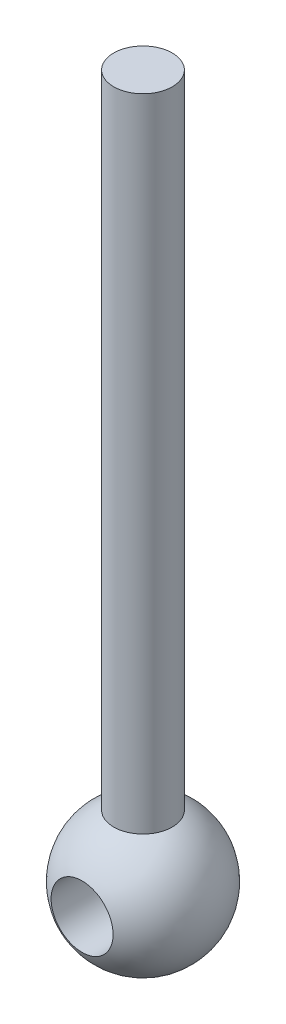
ISO-10303-21;
HEADER;
FILE_DESCRIPTION(('STEP AP214'),'2;1');
FILE_NAME('part.step','',(''),(''),'','','');
FILE_SCHEMA(('AUTOMOTIVE_DESIGN { 1 0 10303 214 1 1 1 1 }'));
ENDSEC;
DATA;
#1=APPLICATION_CONTEXT('core data for automotive mechanical design processes');
#2=APPLICATION_PROTOCOL_DEFINITION('international standard','automotive_design',2000,#1);
#3=PRODUCT_CONTEXT('',#1,'mechanical');
#4=PRODUCT('Part','Part','',(#3));
#5=PRODUCT_RELATED_PRODUCT_CATEGORY('part','',(#4));
#6=PRODUCT_DEFINITION_FORMATION('','',#4);
#7=PRODUCT_DEFINITION_CONTEXT('part definition',#1,'design');
#8=PRODUCT_DEFINITION('design','',#6,#7);
#9=PRODUCT_DEFINITION_SHAPE('','',#8);
#10=(LENGTH_UNIT() NAMED_UNIT(*) SI_UNIT(.MILLI.,.METRE.));
#11=(NAMED_UNIT(*) PLANE_ANGLE_UNIT() SI_UNIT($,.RADIAN.));
#12=(NAMED_UNIT(*) SI_UNIT($,.STERADIAN.) SOLID_ANGLE_UNIT());
#13=UNCERTAINTY_MEASURE_WITH_UNIT(LENGTH_MEASURE(1.E-05),#10,'distance_accuracy_value','');
#14=(GEOMETRIC_REPRESENTATION_CONTEXT(3) GLOBAL_UNCERTAINTY_ASSIGNED_CONTEXT((#13)) GLOBAL_UNIT_ASSIGNED_CONTEXT((#10,
#11,#12)) REPRESENTATION_CONTEXT('',''));
#15=CARTESIAN_POINT('',(0.,0.,0.));
#16=DIRECTION('',(0.,0.,1.));
#17=DIRECTION('',(1.,0.,0.));
#18=AXIS2_PLACEMENT_3D('',#15,#16,#17);
#19=CARTESIAN_POINT('',(0.,0.,0.));
#20=DIRECTION('',(0.,0.,1.));
#21=DIRECTION('',(0.999999999985917,5.30717958668678E-06,0.));
#22=AXIS2_PLACEMENT_3D('',#19,#20,#21);
#23=SPHERICAL_SURFACE('',#22,7.);
#24=CARTESIAN_POINT('',(0.,0.,-6.2385394925415));
#25=DIRECTION('',(0.,0.,1.));
#26=DIRECTION('',(1.,0.,0.));
#27=AXIS2_PLACEMENT_3D('',#24,#25,#26);
#28=CIRCLE('',#27,3.175);
#29=CARTESIAN_POINT('',(3.17499999995529,1.68502951877305E-05,-6.2385394925415));
#30=VERTEX_POINT('',#29);
#31=CARTESIAN_POINT('',(3.175,0.,-6.2385394925415));
#32=VERTEX_POINT('',#31);
#33=EDGE_CURVE('E11',#30,#32,#28,.T.);
#34=ORIENTED_EDGE('',*,*,#33,.T.);
#35=CARTESIAN_POINT('',(0.,0.,0.));
#36=DIRECTION('',(0.,1.,0.));
#37=DIRECTION('',(0.,0.,1.));
#38=AXIS2_PLACEMENT_3D('',#35,#36,#37);
#39=CIRCLE('',#38,7.);
#40=CARTESIAN_POINT('',(3.175,0.,6.2385394925415));
#41=VERTEX_POINT('',#40);
#42=EDGE_CURVE('E69',#41,#32,#39,.T.);
#43=ORIENTED_EDGE('',*,*,#42,.F.);
#44=CARTESIAN_POINT('',(0.,0.,6.2385394925415));
#45=DIRECTION('',(0.,0.,1.));
#46=DIRECTION('',(1.,0.,0.));
#47=AXIS2_PLACEMENT_3D('',#44,#45,#46);
#48=CIRCLE('',#47,3.175);
#49=CARTESIAN_POINT('',(3.17499999995529,1.68502951877305E-05,6.2385394925415));
#50=VERTEX_POINT('',#49);
#51=EDGE_CURVE('E55',#50,#41,#48,.T.);
#52=ORIENTED_EDGE('',*,*,#51,.F.);
#53=CARTESIAN_POINT('',(0.,0.,0.));
#54=DIRECTION('',(-5.30717958668678E-06,0.999999999985917,0.));
#55=DIRECTION('',(0.,0.,1.));
#56=AXIS2_PLACEMENT_3D('',#53,#54,#55);
#57=CIRCLE('',#56,7.);
#58=EDGE_CURVE('E75',#50,#30,#57,.T.);
#59=ORIENTED_EDGE('',*,*,#58,.T.);
#60=EDGE_LOOP('',(#34,#43,#52,#59));
#61=FACE_BOUND('',#60,.T.);
#62=CARTESIAN_POINT('',(0.,6.32455532033676,0.));
#63=DIRECTION('',(0.,-1.,0.));
#64=DIRECTION('',(0.,0.,-1.));
#65=AXIS2_PLACEMENT_3D('',#62,#63,#64);
#66=CIRCLE('',#65,3.);
#67=CARTESIAN_POINT('',(0.,6.32455532033676,-3.));
#68=VERTEX_POINT('',#67);
#69=EDGE_CURVE('E50',#68,#68,#66,.T.);
#70=ORIENTED_EDGE('',*,*,#69,.T.);
#71=EDGE_LOOP('',(#70));
#72=FACE_BOUND('',#71,.T.);
#73=ADVANCED_FACE('F43',(#61,#72),#23,.T.);
#74=CARTESIAN_POINT('',(0.,0.,6.2385394925415));
#75=DIRECTION('',(0.,0.,1.));
#76=DIRECTION('',(1.,0.,0.));
#77=AXIS2_PLACEMENT_3D('',#74,#75,#76);
#78=CYLINDRICAL_SURFACE('',#77,3.175);
#79=DIRECTION('',(0.,0.,1.));
#80=VECTOR('',#79,1.);
#81=CARTESIAN_POINT('',(3.17499999995529,1.68502951877305E-05,-6.2385394925415));
#82=LINE('',#81,#80);
#83=EDGE_CURVE('E78',#30,#50,#82,.T.);
#84=ORIENTED_EDGE('',*,*,#83,.T.);
#85=ORIENTED_EDGE('',*,*,#51,.T.);
#86=DIRECTION('',(0.,0.,1.));
#87=VECTOR('',#86,1.);
#88=CARTESIAN_POINT('',(3.175,0.,-6.2385394925415));
#89=LINE('',#88,#87);
#90=EDGE_CURVE('E79',#32,#41,#89,.T.);
#91=ORIENTED_EDGE('',*,*,#90,.F.);
#92=ORIENTED_EDGE('',*,*,#33,.F.);
#93=EDGE_LOOP('',(#84,#85,#91,#92));
#94=FACE_BOUND('',#93,.T.);
#95=ADVANCED_FACE('F44',(#94),#78,.F.);
#96=CARTESIAN_POINT('',(0.,0.,0.));
#97=DIRECTION('',(-5.30717958668678E-06,0.999999999985917,0.));
#98=DIRECTION('',(0.,0.,1.));
#99=AXIS2_PLACEMENT_3D('',#96,#97,#98);
#100=PLANE('',#99);
#101=ORIENTED_EDGE('',*,*,#58,.F.);
#102=ORIENTED_EDGE('',*,*,#83,.F.);
#103=EDGE_LOOP('',(#101,#102));
#104=FACE_BOUND('',#103,.T.);
#105=ADVANCED_FACE('F84',(#104),#100,.F.);
#106=CARTESIAN_POINT('',(0.,0.,0.));
#107=DIRECTION('',(0.,1.,0.));
#108=DIRECTION('',(0.,0.,1.));
#109=AXIS2_PLACEMENT_3D('',#106,#107,#108);
#110=PLANE('',#109);
#111=ORIENTED_EDGE('',*,*,#42,.T.);
#112=ORIENTED_EDGE('',*,*,#90,.T.);
#113=EDGE_LOOP('',(#111,#112));
#114=FACE_BOUND('',#113,.T.);
#115=ADVANCED_FACE('F73',(#114),#110,.T.);
#116=CARTESIAN_POINT('',(0.,72.,0.));
#117=DIRECTION('',(0.,-1.,0.));
#118=DIRECTION('',(0.,0.,-1.));
#119=AXIS2_PLACEMENT_3D('',#116,#117,#118);
#120=CYLINDRICAL_SURFACE('',#119,3.);
#121=ORIENTED_EDGE('',*,*,#69,.F.);
#122=EDGE_LOOP('',(#121));
#123=FACE_BOUND('',#122,.T.);
#124=CARTESIAN_POINT('',(0.,72.,0.));
#125=DIRECTION('',(0.,1.,0.));
#126=DIRECTION('',(0.,0.,1.));
#127=AXIS2_PLACEMENT_3D('',#124,#125,#126);
#128=CIRCLE('',#127,3.);
#129=CARTESIAN_POINT('',(0.,72.,3.));
#130=VERTEX_POINT('',#129);
#131=EDGE_CURVE('E123',#130,#130,#128,.T.);
#132=ORIENTED_EDGE('',*,*,#131,.F.);
#133=EDGE_LOOP('',(#132));
#134=FACE_BOUND('',#133,.T.);
#135=ADVANCED_FACE('F95',(#123,#134),#120,.T.);
#136=CARTESIAN_POINT('',(0.,72.,0.));
#137=DIRECTION('',(0.,1.,0.));
#138=DIRECTION('',(0.,0.,1.));
#139=AXIS2_PLACEMENT_3D('',#136,#137,#138);
#140=PLANE('',#139);
#141=ORIENTED_EDGE('',*,*,#131,.T.);
#142=EDGE_LOOP('',(#141));
#143=FACE_BOUND('',#142,.T.);
#144=ADVANCED_FACE('F110',(#143),#140,.T.);
#145=CLOSED_SHELL('',(#73,#95,#105,#115,#135,#144));
#146=MANIFOLD_SOLID_BREP('B2',#145);
#147=ADVANCED_BREP_SHAPE_REPRESENTATION('',(#18,#146),#14);
#148=SHAPE_DEFINITION_REPRESENTATION(#9,#147);
ENDSEC;
END-ISO-10303-21;
